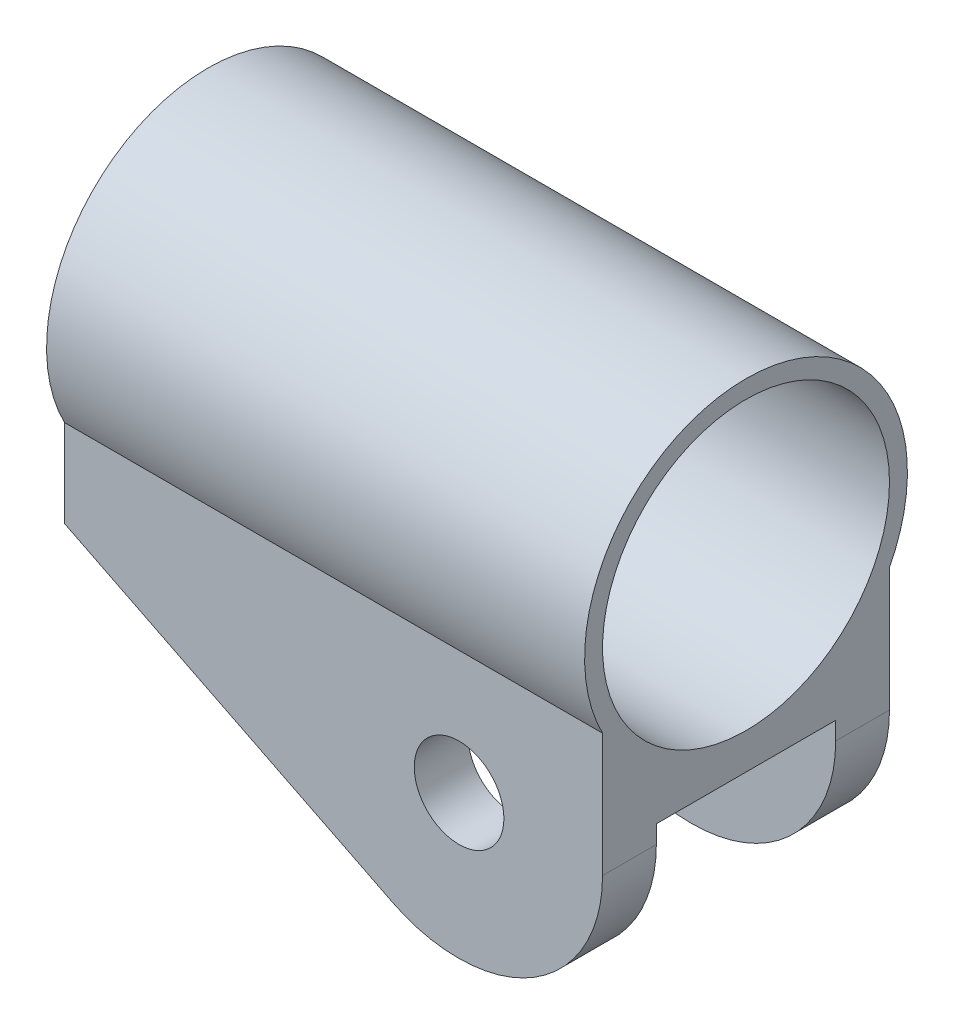
ISO-10303-21;
HEADER;
FILE_DESCRIPTION(('STEP AP214'),'2;1');
FILE_NAME('part.step','',(''),(''),'','','');
FILE_SCHEMA(('AUTOMOTIVE_DESIGN { 1 0 10303 214 1 1 1 1 }'));
ENDSEC;
DATA;
#1=APPLICATION_CONTEXT('core data for automotive mechanical design processes');
#2=APPLICATION_PROTOCOL_DEFINITION('international standard','automotive_design',2000,#1);
#3=PRODUCT_CONTEXT('',#1,'mechanical');
#4=PRODUCT('Part','Part','',(#3));
#5=PRODUCT_RELATED_PRODUCT_CATEGORY('part','',(#4));
#6=PRODUCT_DEFINITION_FORMATION('','',#4);
#7=PRODUCT_DEFINITION_CONTEXT('part definition',#1,'design');
#8=PRODUCT_DEFINITION('design','',#6,#7);
#9=PRODUCT_DEFINITION_SHAPE('','',#8);
#10=(LENGTH_UNIT() NAMED_UNIT(*) SI_UNIT(.MILLI.,.METRE.));
#11=(NAMED_UNIT(*) PLANE_ANGLE_UNIT() SI_UNIT($,.RADIAN.));
#12=(NAMED_UNIT(*) SI_UNIT($,.STERADIAN.) SOLID_ANGLE_UNIT());
#13=UNCERTAINTY_MEASURE_WITH_UNIT(LENGTH_MEASURE(1.E-05),#10,'distance_accuracy_value','');
#14=(GEOMETRIC_REPRESENTATION_CONTEXT(3) GLOBAL_UNCERTAINTY_ASSIGNED_CONTEXT((#13)) GLOBAL_UNIT_ASSIGNED_CONTEXT((#10,
#11,#12)) REPRESENTATION_CONTEXT('',''));
#15=CARTESIAN_POINT('',(0.,0.,0.));
#16=DIRECTION('',(0.,0.,1.));
#17=DIRECTION('',(1.,0.,0.));
#18=AXIS2_PLACEMENT_3D('',#15,#16,#17);
#19=CARTESIAN_POINT('',(0.,-10.,5.));
#20=DIRECTION('',(0.,1.,0.));
#21=DIRECTION('',(0.,0.,1.));
#22=AXIS2_PLACEMENT_3D('',#19,#20,#21);
#23=PLANE('',#22);
#24=DIRECTION('',(1.,0.,0.));
#25=VECTOR('',#24,1.);
#26=CARTESIAN_POINT('',(0.,-10.,-5.));
#27=LINE('',#26,#25);
#28=CARTESIAN_POINT('',(2.,-10.,-5.));
#29=VERTEX_POINT('',#28);
#30=CARTESIAN_POINT('',(19.7087121525221,-10.,-5.));
#31=VERTEX_POINT('',#30);
#32=EDGE_CURVE('E160',#29,#31,#27,.T.);
#33=ORIENTED_EDGE('',*,*,#32,.T.);
#34=DIRECTION('',(0.,0.,1.));
#35=VECTOR('',#34,1.);
#36=CARTESIAN_POINT('',(19.7087121525221,-10.,-9.));
#37=LINE('',#36,#35);
#38=CARTESIAN_POINT('',(19.7087121525221,-10.,5.));
#39=VERTEX_POINT('',#38);
#40=EDGE_CURVE('E48',#31,#39,#37,.T.);
#41=ORIENTED_EDGE('',*,*,#40,.T.);
#42=DIRECTION('',(1.,0.,0.));
#43=VECTOR('',#42,1.);
#44=CARTESIAN_POINT('',(0.,-10.,5.));
#45=LINE('',#44,#43);
#46=CARTESIAN_POINT('',(2.,-10.,5.));
#47=VERTEX_POINT('',#46);
#48=EDGE_CURVE('E167',#47,#39,#45,.T.);
#49=ORIENTED_EDGE('',*,*,#48,.F.);
#50=DIRECTION('',(0.,0.,1.));
#51=VECTOR('',#50,1.);
#52=CARTESIAN_POINT('',(2.,-10.,-9.));
#53=LINE('',#52,#51);
#54=EDGE_CURVE('E214',#29,#47,#53,.T.);
#55=ORIENTED_EDGE('',*,*,#54,.F.);
#56=EDGE_LOOP('',(#33,#41,#49,#55));
#57=FACE_BOUND('',#56,.T.);
#58=ADVANCED_FACE('F33',(#57),#23,.F.);
#59=CARTESIAN_POINT('',(0.,-19.,0.));
#60=DIRECTION('',(0.,-1.,0.));
#61=DIRECTION('',(0.,0.,-1.));
#62=AXIS2_PLACEMENT_3D('',#59,#60,#61);
#63=PLANE('',#62);
#64=DIRECTION('',(-1.,0.,0.));
#65=VECTOR('',#64,1.);
#66=CARTESIAN_POINT('',(0.,-19.,8.));
#67=LINE('',#66,#65);
#68=CARTESIAN_POINT('',(22.,-19.,8.));
#69=VERTEX_POINT('',#68);
#70=CARTESIAN_POINT('',(21.8885438199983,-19.,8.));
#71=VERTEX_POINT('',#70);
#72=EDGE_CURVE('E189',#69,#71,#67,.T.);
#73=ORIENTED_EDGE('',*,*,#72,.T.);
#74=DIRECTION('',(0.,0.,1.));
#75=VECTOR('',#74,1.);
#76=CARTESIAN_POINT('',(21.8885438199983,-19.,5.));
#77=LINE('',#76,#75);
#78=CARTESIAN_POINT('',(21.8885438199983,-19.,5.));
#79=VERTEX_POINT('',#78);
#80=EDGE_CURVE('E246',#71,#79,#77,.F.);
#81=ORIENTED_EDGE('',*,*,#80,.T.);
#82=DIRECTION('',(1.,0.,0.));
#83=VECTOR('',#82,1.);
#84=CARTESIAN_POINT('',(0.,-19.,5.));
#85=LINE('',#84,#83);
#86=CARTESIAN_POINT('',(22.,-19.,5.));
#87=VERTEX_POINT('',#86);
#88=EDGE_CURVE('E164',#79,#87,#85,.T.);
#89=ORIENTED_EDGE('',*,*,#88,.T.);
#90=DIRECTION('',(0.,0.,1.));
#91=VECTOR('',#90,1.);
#92=CARTESIAN_POINT('',(22.,-19.,0.));
#93=LINE('',#92,#91);
#94=EDGE_CURVE('E243',#87,#69,#93,.T.);
#95=ORIENTED_EDGE('',*,*,#94,.T.);
#96=EDGE_LOOP('',(#73,#81,#89,#95));
#97=FACE_BOUND('',#96,.T.);
#98=ADVANCED_FACE('F300',(#97),#63,.T.);
#99=CARTESIAN_POINT('',(30.,0.,0.));
#100=DIRECTION('',(-1.,0.,0.));
#101=DIRECTION('',(0.,0.,1.));
#102=AXIS2_PLACEMENT_3D('',#99,#100,#101);
#103=CYLINDRICAL_SURFACE('',#102,9.);
#104=DIRECTION('',(-1.,0.,0.));
#105=VECTOR('',#104,1.);
#106=CARTESIAN_POINT('',(30.,-4.12310562561767,-8.));
#107=LINE('',#106,#105);
#108=CARTESIAN_POINT('',(0.,-4.12310562561767,-8.));
#109=VERTEX_POINT('',#108);
#110=CARTESIAN_POINT('',(30.,-4.12310562561767,-8.));
#111=VERTEX_POINT('',#110);
#112=EDGE_CURVE('E180',#109,#111,#107,.F.);
#113=ORIENTED_EDGE('',*,*,#112,.F.);
#114=CARTESIAN_POINT('',(0.,0.,0.));
#115=DIRECTION('',(1.,0.,0.));
#116=DIRECTION('',(0.,0.,-1.));
#117=AXIS2_PLACEMENT_3D('',#114,#115,#116);
#118=CIRCLE('',#117,9.);
#119=CARTESIAN_POINT('',(0.,-4.12310562561766,8.));
#120=VERTEX_POINT('',#119);
#121=EDGE_CURVE('E204',#109,#120,#118,.T.);
#122=ORIENTED_EDGE('',*,*,#121,.T.);
#123=DIRECTION('',(-1.,0.,0.));
#124=VECTOR('',#123,1.);
#125=CARTESIAN_POINT('',(30.,-4.12310562561766,8.));
#126=LINE('',#125,#124);
#127=CARTESIAN_POINT('',(30.,-4.12310562561766,8.));
#128=VERTEX_POINT('',#127);
#129=EDGE_CURVE('E183',#128,#120,#126,.T.);
#130=ORIENTED_EDGE('',*,*,#129,.F.);
#131=CARTESIAN_POINT('',(30.,0.,0.));
#132=DIRECTION('',(1.,0.,0.));
#133=DIRECTION('',(0.,0.,-1.));
#134=AXIS2_PLACEMENT_3D('',#131,#132,#133);
#135=CIRCLE('',#134,9.);
#136=EDGE_CURVE('E207',#111,#128,#135,.T.);
#137=ORIENTED_EDGE('',*,*,#136,.F.);
#138=EDGE_LOOP('',(#113,#122,#130,#137));
#139=FACE_BOUND('',#138,.T.);
#140=ADVANCED_FACE('F282',(#139),#103,.T.);
#141=CARTESIAN_POINT('',(30.,0.,0.));
#142=DIRECTION('',(1.,0.,0.));
#143=DIRECTION('',(0.,0.,-1.));
#144=AXIS2_PLACEMENT_3D('',#141,#142,#143);
#145=PLANE('',#144);
#146=DIRECTION('',(0.,1.,0.));
#147=VECTOR('',#146,1.);
#148=CARTESIAN_POINT('',(30.,-19.,-5.));
#149=LINE('',#148,#147);
#150=CARTESIAN_POINT('',(30.,-11.,-5.));
#151=VERTEX_POINT('',#150);
#152=CARTESIAN_POINT('',(30.,-10.,-5.));
#153=VERTEX_POINT('',#152);
#154=EDGE_CURVE('E158',#151,#153,#149,.T.);
#155=ORIENTED_EDGE('',*,*,#154,.F.);
#156=DIRECTION('',(0.,0.,1.));
#157=VECTOR('',#156,1.);
#158=CARTESIAN_POINT('',(30.,-11.,0.));
#159=LINE('',#158,#157);
#160=CARTESIAN_POINT('',(30.,-11.,-8.));
#161=VERTEX_POINT('',#160);
#162=EDGE_CURVE('E41',#151,#161,#159,.F.);
#163=ORIENTED_EDGE('',*,*,#162,.T.);
#164=DIRECTION('',(0.,1.,0.));
#165=VECTOR('',#164,1.);
#166=CARTESIAN_POINT('',(30.,-19.,-8.));
#167=LINE('',#166,#165);
#168=EDGE_CURVE('E196',#161,#111,#167,.T.);
#169=ORIENTED_EDGE('',*,*,#168,.T.);
#170=ORIENTED_EDGE('',*,*,#136,.T.);
#171=DIRECTION('',(0.,1.,0.));
#172=VECTOR('',#171,1.);
#173=CARTESIAN_POINT('',(30.,-19.,8.));
#174=LINE('',#173,#172);
#175=CARTESIAN_POINT('',(30.,-11.,8.));
#176=VERTEX_POINT('',#175);
#177=EDGE_CURVE('E194',#176,#128,#174,.T.);
#178=ORIENTED_EDGE('',*,*,#177,.F.);
#179=DIRECTION('',(0.,0.,1.));
#180=VECTOR('',#179,1.);
#181=CARTESIAN_POINT('',(30.,-11.,0.));
#182=LINE('',#181,#180);
#183=CARTESIAN_POINT('',(30.,-11.,5.));
#184=VERTEX_POINT('',#183);
#185=EDGE_CURVE('E55',#176,#184,#182,.F.);
#186=ORIENTED_EDGE('',*,*,#185,.T.);
#187=DIRECTION('',(0.,-1.,0.));
#188=VECTOR('',#187,1.);
#189=CARTESIAN_POINT('',(30.,-19.,5.));
#190=LINE('',#189,#188);
#191=CARTESIAN_POINT('',(30.,-10.,5.));
#192=VERTEX_POINT('',#191);
#193=EDGE_CURVE('E298',#192,#184,#190,.T.);
#194=ORIENTED_EDGE('',*,*,#193,.F.);
#195=DIRECTION('',(0.,0.,1.));
#196=VECTOR('',#195,1.);
#197=CARTESIAN_POINT('',(30.,-10.,5.));
#198=LINE('',#197,#196);
#199=EDGE_CURVE('E172',#153,#192,#198,.T.);
#200=ORIENTED_EDGE('',*,*,#199,.F.);
#201=EDGE_LOOP('',(#155,#163,#169,#170,#178,#186,#194,#200));
#202=FACE_BOUND('',#201,.T.);
#203=CARTESIAN_POINT('',(30.,0.,0.));
#204=DIRECTION('',(1.,0.,0.));
#205=DIRECTION('',(0.,0.,-1.));
#206=AXIS2_PLACEMENT_3D('',#203,#204,#205);
#207=CIRCLE('',#206,8.);
#208=CARTESIAN_POINT('',(30.,0.,-8.));
#209=VERTEX_POINT('',#208);
#210=EDGE_CURVE('E201',#209,#209,#207,.T.);
#211=ORIENTED_EDGE('',*,*,#210,.F.);
#212=EDGE_LOOP('',(#211));
#213=FACE_BOUND('',#212,.T.);
#214=ADVANCED_FACE('F254',(#202,#213),#145,.T.);
#215=CARTESIAN_POINT('',(0.,0.,0.));
#216=DIRECTION('',(1.,0.,0.));
#217=DIRECTION('',(0.,0.,-1.));
#218=AXIS2_PLACEMENT_3D('',#215,#216,#217);
#219=PLANE('',#218);
#220=DIRECTION('',(0.,1.,0.));
#221=VECTOR('',#220,1.);
#222=CARTESIAN_POINT('',(0.,-19.,-8.));
#223=LINE('',#222,#221);
#224=CARTESIAN_POINT('',(0.,-9.,-8.));
#225=VERTEX_POINT('',#224);
#226=EDGE_CURVE('E198',#225,#109,#223,.T.);
#227=ORIENTED_EDGE('',*,*,#226,.F.);
#228=DIRECTION('',(0.,0.,1.));
#229=VECTOR('',#228,1.);
#230=CARTESIAN_POINT('',(0.,-9.,-9.));
#231=LINE('',#230,#229);
#232=CARTESIAN_POINT('',(0.,-9.,8.));
#233=VERTEX_POINT('',#232);
#234=EDGE_CURVE('E175',#225,#233,#231,.T.);
#235=ORIENTED_EDGE('',*,*,#234,.T.);
#236=DIRECTION('',(0.,1.,0.));
#237=VECTOR('',#236,1.);
#238=CARTESIAN_POINT('',(0.,-19.,8.));
#239=LINE('',#238,#237);
#240=EDGE_CURVE('E192',#233,#120,#239,.T.);
#241=ORIENTED_EDGE('',*,*,#240,.T.);
#242=ORIENTED_EDGE('',*,*,#121,.F.);
#243=EDGE_LOOP('',(#227,#235,#241,#242));
#244=FACE_BOUND('',#243,.T.);
#245=CARTESIAN_POINT('',(0.,0.,0.));
#246=DIRECTION('',(1.,0.,0.));
#247=DIRECTION('',(0.,0.,-1.));
#248=AXIS2_PLACEMENT_3D('',#245,#246,#247);
#249=CIRCLE('',#248,8.);
#250=CARTESIAN_POINT('',(0.,0.,-8.));
#251=VERTEX_POINT('',#250);
#252=EDGE_CURVE('E200',#251,#251,#249,.T.);
#253=ORIENTED_EDGE('',*,*,#252,.T.);
#254=EDGE_LOOP('',(#253));
#255=FACE_BOUND('',#254,.T.);
#256=ADVANCED_FACE('F284',(#244,#255),#219,.F.);
#257=CARTESIAN_POINT('',(30.,0.,0.));
#258=DIRECTION('',(-1.,0.,0.));
#259=DIRECTION('',(0.,0.,1.));
#260=AXIS2_PLACEMENT_3D('',#257,#258,#259);
#261=CYLINDRICAL_SURFACE('',#260,8.);
#262=ORIENTED_EDGE('',*,*,#210,.T.);
#263=EDGE_LOOP('',(#262));
#264=FACE_BOUND('',#263,.T.);
#265=ORIENTED_EDGE('',*,*,#252,.F.);
#266=EDGE_LOOP('',(#265));
#267=FACE_BOUND('',#266,.T.);
#268=ADVANCED_FACE('F329',(#264,#267),#261,.F.);
#269=CARTESIAN_POINT('',(0.,-19.,-8.));
#270=DIRECTION('',(0.,0.,1.));
#271=DIRECTION('',(1.,0.,0.));
#272=AXIS2_PLACEMENT_3D('',#269,#270,#271);
#273=PLANE('',#272);
#274=CARTESIAN_POINT('',(22.,-11.,-8.));
#275=DIRECTION('',(0.,0.,1.));
#276=DIRECTION('',(1.,0.,0.));
#277=AXIS2_PLACEMENT_3D('',#274,#275,#276);
#278=CIRCLE('',#277,2.5);
#279=CARTESIAN_POINT('',(24.5,-11.,-8.));
#280=VERTEX_POINT('',#279);
#281=EDGE_CURVE('E310',#280,#280,#278,.T.);
#282=ORIENTED_EDGE('',*,*,#281,.T.);
#283=EDGE_LOOP('',(#282));
#284=FACE_BOUND('',#283,.T.);
#285=DIRECTION('',(1.,0.,0.));
#286=VECTOR('',#285,1.);
#287=CARTESIAN_POINT('',(0.,-19.,-8.));
#288=LINE('',#287,#286);
#289=CARTESIAN_POINT('',(21.8885438199983,-19.,-8.));
#290=VERTEX_POINT('',#289);
#291=CARTESIAN_POINT('',(22.,-19.,-8.));
#292=VERTEX_POINT('',#291);
#293=EDGE_CURVE('E186',#290,#292,#288,.T.);
#294=ORIENTED_EDGE('',*,*,#293,.F.);
#295=CARTESIAN_POINT('',(21.8885438199983,-11.,-8.));
#296=DIRECTION('',(0.,0.,1.));
#297=DIRECTION('',(1.,0.,0.));
#298=AXIS2_PLACEMENT_3D('',#295,#296,#297);
#299=CIRCLE('',#298,8.);
#300=CARTESIAN_POINT('',(18.3108350559987,-18.1554175279993,-8.));
#301=VERTEX_POINT('',#300);
#302=EDGE_CURVE('E237',#290,#301,#299,.F.);
#303=ORIENTED_EDGE('',*,*,#302,.T.);
#304=DIRECTION('',(-0.894427190999916,0.447213595499958,0.));
#305=VECTOR('',#304,1.);
#306=CARTESIAN_POINT('',(4.,-11.,-8.));
#307=LINE('',#306,#305);
#308=EDGE_CURVE('E178',#301,#225,#307,.T.);
#309=ORIENTED_EDGE('',*,*,#308,.T.);
#310=ORIENTED_EDGE('',*,*,#226,.T.);
#311=ORIENTED_EDGE('',*,*,#112,.T.);
#312=ORIENTED_EDGE('',*,*,#168,.F.);
#313=CARTESIAN_POINT('',(22.,-11.,-8.));
#314=DIRECTION('',(0.,0.,1.));
#315=DIRECTION('',(1.,0.,0.));
#316=AXIS2_PLACEMENT_3D('',#313,#314,#315);
#317=CIRCLE('',#316,8.);
#318=EDGE_CURVE('E235',#161,#292,#317,.F.);
#319=ORIENTED_EDGE('',*,*,#318,.T.);
#320=EDGE_LOOP('',(#294,#303,#309,#310,#311,#312,#319));
#321=FACE_BOUND('',#320,.T.);
#322=ADVANCED_FACE('F261',(#284,#321),#273,.F.);
#323=CARTESIAN_POINT('',(0.,-19.,8.));
#324=DIRECTION('',(0.,0.,-1.));
#325=DIRECTION('',(-1.,0.,0.));
#326=AXIS2_PLACEMENT_3D('',#323,#324,#325);
#327=PLANE('',#326);
#328=CARTESIAN_POINT('',(22.,-11.,8.));
#329=DIRECTION('',(0.,0.,1.));
#330=DIRECTION('',(1.,0.,0.));
#331=AXIS2_PLACEMENT_3D('',#328,#329,#330);
#332=CIRCLE('',#331,2.5);
#333=CARTESIAN_POINT('',(24.5,-11.,8.));
#334=VERTEX_POINT('',#333);
#335=EDGE_CURVE('E154',#334,#334,#332,.T.);
#336=ORIENTED_EDGE('',*,*,#335,.F.);
#337=EDGE_LOOP('',(#336));
#338=FACE_BOUND('',#337,.T.);
#339=DIRECTION('',(-0.894427190999916,0.447213595499958,0.));
#340=VECTOR('',#339,1.);
#341=CARTESIAN_POINT('',(0.,-9.,8.));
#342=LINE('',#341,#340);
#343=CARTESIAN_POINT('',(18.3108350559987,-18.1554175279993,8.));
#344=VERTEX_POINT('',#343);
#345=EDGE_CURVE('E173',#344,#233,#342,.T.);
#346=ORIENTED_EDGE('',*,*,#345,.F.);
#347=CARTESIAN_POINT('',(21.8885438199983,-11.,8.));
#348=DIRECTION('',(0.,0.,-1.));
#349=DIRECTION('',(-1.,0.,0.));
#350=AXIS2_PLACEMENT_3D('',#347,#348,#349);
#351=CIRCLE('',#350,8.);
#352=EDGE_CURVE('E241',#344,#71,#351,.F.);
#353=ORIENTED_EDGE('',*,*,#352,.T.);
#354=ORIENTED_EDGE('',*,*,#72,.F.);
#355=CARTESIAN_POINT('',(22.,-11.,8.));
#356=DIRECTION('',(0.,0.,-1.));
#357=DIRECTION('',(-1.,0.,0.));
#358=AXIS2_PLACEMENT_3D('',#355,#356,#357);
#359=CIRCLE('',#358,8.);
#360=EDGE_CURVE('E239',#69,#176,#359,.F.);
#361=ORIENTED_EDGE('',*,*,#360,.T.);
#362=ORIENTED_EDGE('',*,*,#177,.T.);
#363=ORIENTED_EDGE('',*,*,#129,.T.);
#364=ORIENTED_EDGE('',*,*,#240,.F.);
#365=EDGE_LOOP('',(#346,#353,#354,#361,#362,#363,#364));
#366=FACE_BOUND('',#365,.T.);
#367=ADVANCED_FACE('F289',(#338,#366),#327,.F.);
#368=DIRECTION('',(1.,0.,0.));
#369=VECTOR('',#368,1.);
#370=CARTESIAN_POINT('',(0.,-19.,-5.));
#371=LINE('',#370,#369);
#372=CARTESIAN_POINT('',(21.8885438199983,-19.,-5.));
#373=VERTEX_POINT('',#372);
#374=CARTESIAN_POINT('',(22.,-19.,-5.));
#375=VERTEX_POINT('',#374);
#376=EDGE_CURVE('E161',#373,#375,#371,.T.);
#377=ORIENTED_EDGE('',*,*,#376,.F.);
#378=DIRECTION('',(0.,0.,1.));
#379=VECTOR('',#378,1.);
#380=CARTESIAN_POINT('',(21.8885438199983,-19.,-8.));
#381=LINE('',#380,#379);
#382=EDGE_CURVE('E233',#373,#290,#381,.F.);
#383=ORIENTED_EDGE('',*,*,#382,.T.);
#384=ORIENTED_EDGE('',*,*,#293,.T.);
#385=DIRECTION('',(0.,0.,1.));
#386=VECTOR('',#385,1.);
#387=CARTESIAN_POINT('',(22.,-19.,0.));
#388=LINE('',#387,#386);
#389=EDGE_CURVE('E230',#292,#375,#388,.T.);
#390=ORIENTED_EDGE('',*,*,#389,.T.);
#391=EDGE_LOOP('',(#377,#383,#384,#390));
#392=FACE_BOUND('',#391,.T.);
#393=ADVANCED_FACE('F267',(#392),#63,.T.);
#394=CARTESIAN_POINT('',(0.,-9.,-9.));
#395=DIRECTION('',(0.447213595499958,0.894427190999916,0.));
#396=DIRECTION('',(-0.894427190999916,0.447213595499958,0.));
#397=AXIS2_PLACEMENT_3D('',#394,#395,#396);
#398=PLANE('',#397);
#399=ORIENTED_EDGE('',*,*,#308,.F.);
#400=DIRECTION('',(0.,0.,1.));
#401=VECTOR('',#400,1.);
#402=CARTESIAN_POINT('',(18.3108350559987,-18.1554175279993,-5.));
#403=LINE('',#402,#401);
#404=CARTESIAN_POINT('',(18.3108350559987,-18.1554175279993,-5.));
#405=VERTEX_POINT('',#404);
#406=EDGE_CURVE('E223',#301,#405,#403,.T.);
#407=ORIENTED_EDGE('',*,*,#406,.T.);
#408=DIRECTION('',(-0.894427190999916,0.447213595499958,0.));
#409=VECTOR('',#408,1.);
#410=CARTESIAN_POINT('',(0.,-9.,-5.));
#411=LINE('',#410,#409);
#412=EDGE_CURVE('E210',#405,#29,#411,.T.);
#413=ORIENTED_EDGE('',*,*,#412,.T.);
#414=ORIENTED_EDGE('',*,*,#54,.T.);
#415=DIRECTION('',(0.894427190999916,-0.447213595499958,0.));
#416=VECTOR('',#415,1.);
#417=CARTESIAN_POINT('',(0.,-9.,5.));
#418=LINE('',#417,#416);
#419=CARTESIAN_POINT('',(18.3108350559987,-18.1554175279993,5.));
#420=VERTEX_POINT('',#419);
#421=EDGE_CURVE('E217',#47,#420,#418,.T.);
#422=ORIENTED_EDGE('',*,*,#421,.T.);
#423=DIRECTION('',(0.,0.,1.));
#424=VECTOR('',#423,1.);
#425=CARTESIAN_POINT('',(18.3108350559987,-18.1554175279993,8.));
#426=LINE('',#425,#424);
#427=EDGE_CURVE('E220',#420,#344,#426,.T.);
#428=ORIENTED_EDGE('',*,*,#427,.T.);
#429=ORIENTED_EDGE('',*,*,#345,.T.);
#430=ORIENTED_EDGE('',*,*,#234,.F.);
#431=EDGE_LOOP('',(#399,#407,#413,#414,#422,#428,#429,#430));
#432=FACE_BOUND('',#431,.T.);
#433=ADVANCED_FACE('F276',(#432),#398,.F.);
#434=CARTESIAN_POINT('',(0.,-19.,5.));
#435=DIRECTION('',(0.,0.,1.));
#436=DIRECTION('',(0.,-1.,0.));
#437=AXIS2_PLACEMENT_3D('',#434,#435,#436);
#438=PLANE('',#437);
#439=ORIENTED_EDGE('',*,*,#48,.T.);
#440=CARTESIAN_POINT('',(22.,-11.,5.));
#441=DIRECTION('',(0.,0.,1.));
#442=DIRECTION('',(0.,-1.,0.));
#443=AXIS2_PLACEMENT_3D('',#440,#441,#442);
#444=CIRCLE('',#443,2.5);
#445=CARTESIAN_POINT('',(24.2912878474779,-10.,5.));
#446=VERTEX_POINT('',#445);
#447=EDGE_CURVE('E309',#39,#446,#444,.T.);
#448=ORIENTED_EDGE('',*,*,#447,.T.);
#449=EDGE_CURVE('E153',#446,#192,#45,.T.);
#450=ORIENTED_EDGE('',*,*,#449,.T.);
#451=ORIENTED_EDGE('',*,*,#193,.T.);
#452=CARTESIAN_POINT('',(22.,-11.,5.));
#453=DIRECTION('',(0.,0.,1.));
#454=DIRECTION('',(0.,-1.,0.));
#455=AXIS2_PLACEMENT_3D('',#452,#453,#454);
#456=CIRCLE('',#455,8.);
#457=EDGE_CURVE('E248',#184,#87,#456,.F.);
#458=ORIENTED_EDGE('',*,*,#457,.T.);
#459=ORIENTED_EDGE('',*,*,#88,.F.);
#460=CARTESIAN_POINT('',(21.8885438199983,-11.,5.));
#461=DIRECTION('',(0.,0.,1.));
#462=DIRECTION('',(0.,-1.,0.));
#463=AXIS2_PLACEMENT_3D('',#460,#461,#462);
#464=CIRCLE('',#463,8.);
#465=EDGE_CURVE('E250',#79,#420,#464,.F.);
#466=ORIENTED_EDGE('',*,*,#465,.T.);
#467=ORIENTED_EDGE('',*,*,#421,.F.);
#468=EDGE_LOOP('',(#439,#448,#450,#451,#458,#459,#466,#467));
#469=FACE_BOUND('',#468,.T.);
#470=ADVANCED_FACE('F296',(#469),#438,.F.);
#471=ORIENTED_EDGE('',*,*,#449,.F.);
#472=DIRECTION('',(0.,0.,1.));
#473=VECTOR('',#472,1.);
#474=CARTESIAN_POINT('',(24.2912878474779,-10.,-9.));
#475=LINE('',#474,#473);
#476=CARTESIAN_POINT('',(24.2912878474779,-10.,-5.));
#477=VERTEX_POINT('',#476);
#478=EDGE_CURVE('E141',#446,#477,#475,.F.);
#479=ORIENTED_EDGE('',*,*,#478,.T.);
#480=EDGE_CURVE('E151',#477,#153,#27,.T.);
#481=ORIENTED_EDGE('',*,*,#480,.T.);
#482=ORIENTED_EDGE('',*,*,#199,.T.);
#483=EDGE_LOOP('',(#471,#479,#481,#482));
#484=FACE_BOUND('',#483,.T.);
#485=ADVANCED_FACE('F149',(#484),#23,.F.);
#486=CARTESIAN_POINT('',(0.,-19.,-5.));
#487=DIRECTION('',(0.,0.,-1.));
#488=DIRECTION('',(0.,1.,0.));
#489=AXIS2_PLACEMENT_3D('',#486,#487,#488);
#490=PLANE('',#489);
#491=ORIENTED_EDGE('',*,*,#480,.F.);
#492=CARTESIAN_POINT('',(22.,-11.,-5.));
#493=DIRECTION('',(0.,0.,-1.));
#494=DIRECTION('',(0.,1.,0.));
#495=AXIS2_PLACEMENT_3D('',#492,#493,#494);
#496=CIRCLE('',#495,2.5);
#497=EDGE_CURVE('E11',#477,#31,#496,.T.);
#498=ORIENTED_EDGE('',*,*,#497,.T.);
#499=ORIENTED_EDGE('',*,*,#32,.F.);
#500=ORIENTED_EDGE('',*,*,#412,.F.);
#501=CARTESIAN_POINT('',(21.8885438199983,-11.,-5.));
#502=DIRECTION('',(0.,0.,-1.));
#503=DIRECTION('',(0.,1.,0.));
#504=AXIS2_PLACEMENT_3D('',#501,#502,#503);
#505=CIRCLE('',#504,8.);
#506=EDGE_CURVE('E228',#405,#373,#505,.F.);
#507=ORIENTED_EDGE('',*,*,#506,.T.);
#508=ORIENTED_EDGE('',*,*,#376,.T.);
#509=CARTESIAN_POINT('',(22.,-11.,-5.));
#510=DIRECTION('',(0.,0.,-1.));
#511=DIRECTION('',(0.,1.,0.));
#512=AXIS2_PLACEMENT_3D('',#509,#510,#511);
#513=CIRCLE('',#512,8.);
#514=EDGE_CURVE('E226',#375,#151,#513,.F.);
#515=ORIENTED_EDGE('',*,*,#514,.T.);
#516=ORIENTED_EDGE('',*,*,#154,.T.);
#517=EDGE_LOOP('',(#491,#498,#499,#500,#507,#508,#515,#516));
#518=FACE_BOUND('',#517,.T.);
#519=ADVANCED_FACE('F156',(#518),#490,.F.);
#520=CARTESIAN_POINT('',(21.8885438199983,-11.,-9.));
#521=DIRECTION('',(0.,0.,-1.));
#522=DIRECTION('',(-1.,0.,0.));
#523=AXIS2_PLACEMENT_3D('',#520,#521,#522);
#524=CYLINDRICAL_SURFACE('',#523,8.);
#525=ORIENTED_EDGE('',*,*,#302,.F.);
#526=ORIENTED_EDGE('',*,*,#382,.F.);
#527=ORIENTED_EDGE('',*,*,#506,.F.);
#528=ORIENTED_EDGE('',*,*,#406,.F.);
#529=EDGE_LOOP('',(#525,#526,#527,#528));
#530=FACE_BOUND('',#529,.T.);
#531=ADVANCED_FACE('F273',(#530),#524,.T.);
#532=CARTESIAN_POINT('',(21.8885438199983,-11.,-9.));
#533=DIRECTION('',(0.,0.,-1.));
#534=DIRECTION('',(-1.,0.,0.));
#535=AXIS2_PLACEMENT_3D('',#532,#533,#534);
#536=CYLINDRICAL_SURFACE('',#535,8.);
#537=ORIENTED_EDGE('',*,*,#465,.F.);
#538=ORIENTED_EDGE('',*,*,#80,.F.);
#539=ORIENTED_EDGE('',*,*,#352,.F.);
#540=ORIENTED_EDGE('',*,*,#427,.F.);
#541=EDGE_LOOP('',(#537,#538,#539,#540));
#542=FACE_BOUND('',#541,.T.);
#543=ADVANCED_FACE('F304',(#542),#536,.T.);
#544=CARTESIAN_POINT('',(22.,-11.,0.));
#545=DIRECTION('',(0.,0.,1.));
#546=DIRECTION('',(1.,0.,0.));
#547=AXIS2_PLACEMENT_3D('',#544,#545,#546);
#548=CYLINDRICAL_SURFACE('',#547,8.);
#549=ORIENTED_EDGE('',*,*,#318,.F.);
#550=ORIENTED_EDGE('',*,*,#162,.F.);
#551=ORIENTED_EDGE('',*,*,#514,.F.);
#552=ORIENTED_EDGE('',*,*,#389,.F.);
#553=EDGE_LOOP('',(#549,#550,#551,#552));
#554=FACE_BOUND('',#553,.T.);
#555=ADVANCED_FACE('F264',(#554),#548,.T.);
#556=CARTESIAN_POINT('',(22.,-11.,0.));
#557=DIRECTION('',(0.,0.,1.));
#558=DIRECTION('',(1.,0.,0.));
#559=AXIS2_PLACEMENT_3D('',#556,#557,#558);
#560=CYLINDRICAL_SURFACE('',#559,8.);
#561=ORIENTED_EDGE('',*,*,#457,.F.);
#562=ORIENTED_EDGE('',*,*,#185,.F.);
#563=ORIENTED_EDGE('',*,*,#360,.F.);
#564=ORIENTED_EDGE('',*,*,#94,.F.);
#565=EDGE_LOOP('',(#561,#562,#563,#564));
#566=FACE_BOUND('',#565,.T.);
#567=ADVANCED_FACE('F35',(#566),#560,.T.);
#568=CARTESIAN_POINT('',(22.,-11.,-9.));
#569=DIRECTION('',(0.,0.,1.));
#570=DIRECTION('',(1.,0.,0.));
#571=AXIS2_PLACEMENT_3D('',#568,#569,#570);
#572=CYLINDRICAL_SURFACE('',#571,2.5);
#573=ORIENTED_EDGE('',*,*,#40,.F.);
#574=ORIENTED_EDGE('',*,*,#497,.F.);
#575=ORIENTED_EDGE('',*,*,#478,.F.);
#576=ORIENTED_EDGE('',*,*,#447,.F.);
#577=EDGE_LOOP('',(#573,#574,#575,#576));
#578=FACE_BOUND('',#577,.T.);
#579=ORIENTED_EDGE('',*,*,#335,.T.);
#580=EDGE_LOOP('',(#579));
#581=FACE_BOUND('',#580,.T.);
#582=ORIENTED_EDGE('',*,*,#281,.F.);
#583=EDGE_LOOP('',(#582));
#584=FACE_BOUND('',#583,.T.);
#585=ADVANCED_FACE('F139',(#578,#581,#584),#572,.F.);
#586=CLOSED_SHELL('',(#58,#98,#140,#214,#256,#268,#322,#367,#393,#433,#470,#485,#519,#531,#543,
#555,#567,#585));
#587=MANIFOLD_SOLID_BREP('B2',#586);
#588=ADVANCED_BREP_SHAPE_REPRESENTATION('',(#18,#587),#14);
#589=SHAPE_DEFINITION_REPRESENTATION(#9,#588);
ENDSEC;
END-ISO-10303-21;
